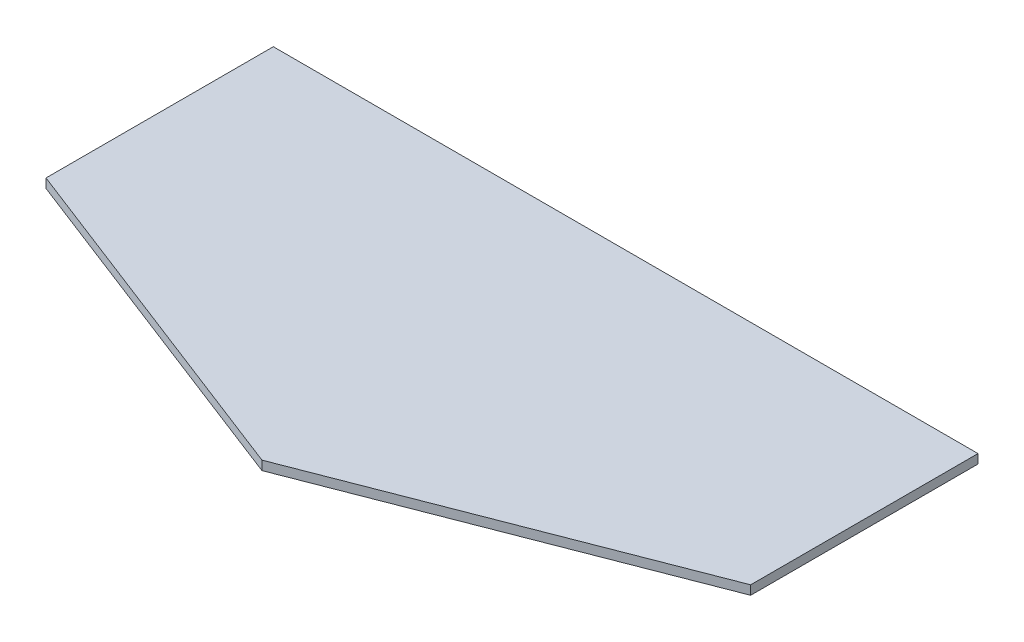
ISO-10303-21;
HEADER;
FILE_DESCRIPTION(('STEP AP214'),'2;1');
FILE_NAME('part.step','',(''),(''),'','','');
FILE_SCHEMA(('AUTOMOTIVE_DESIGN { 1 0 10303 214 1 1 1 1 }'));
ENDSEC;
DATA;
#1=APPLICATION_CONTEXT('core data for automotive mechanical design processes');
#2=APPLICATION_PROTOCOL_DEFINITION('international standard','automotive_design',2000,#1);
#3=PRODUCT_CONTEXT('',#1,'mechanical');
#4=PRODUCT('Part','Part','',(#3));
#5=PRODUCT_RELATED_PRODUCT_CATEGORY('part','',(#4));
#6=PRODUCT_DEFINITION_FORMATION('','',#4);
#7=PRODUCT_DEFINITION_CONTEXT('part definition',#1,'design');
#8=PRODUCT_DEFINITION('design','',#6,#7);
#9=PRODUCT_DEFINITION_SHAPE('','',#8);
#10=(LENGTH_UNIT() NAMED_UNIT(*) SI_UNIT(.MILLI.,.METRE.));
#11=(NAMED_UNIT(*) PLANE_ANGLE_UNIT() SI_UNIT($,.RADIAN.));
#12=(NAMED_UNIT(*) SI_UNIT($,.STERADIAN.) SOLID_ANGLE_UNIT());
#13=UNCERTAINTY_MEASURE_WITH_UNIT(LENGTH_MEASURE(1.E-05),#10,'distance_accuracy_value','');
#14=(GEOMETRIC_REPRESENTATION_CONTEXT(3) GLOBAL_UNCERTAINTY_ASSIGNED_CONTEXT((#13)) GLOBAL_UNIT_ASSIGNED_CONTEXT((#10,
#11,#12)) REPRESENTATION_CONTEXT('',''));
#15=CARTESIAN_POINT('',(0.,0.,0.));
#16=DIRECTION('',(0.,0.,1.));
#17=DIRECTION('',(1.,0.,0.));
#18=AXIS2_PLACEMENT_3D('',#15,#16,#17);
#19=CARTESIAN_POINT('',(114.531674208145,3.,128.742081447964));
#20=DIRECTION('',(-0.360994102557712,0.,-0.93256809827409));
#21=DIRECTION('',(-0.93256809827409,0.,0.360994102557712));
#22=AXIS2_PLACEMENT_3D('',#19,#20,#21);
#23=PLANE('',#22);
#24=DIRECTION('',(0.93256809827409,0.,-0.360994102557712));
#25=VECTOR('',#24,1.);
#26=CARTESIAN_POINT('',(114.531674208145,1.,128.742081447964));
#27=LINE('',#26,#25);
#28=CARTESIAN_POINT('',(155.,1.,113.076923076923));
#29=VERTEX_POINT('',#28);
#30=CARTESIAN_POINT('',(232.5,1.,83.0769230769231));
#31=VERTEX_POINT('',#30);
#32=EDGE_CURVE('E109',#29,#31,#27,.T.);
#33=ORIENTED_EDGE('',*,*,#32,.T.);
#34=DIRECTION('',(0.,-1.,0.));
#35=VECTOR('',#34,1.);
#36=CARTESIAN_POINT('',(232.5,3.,83.0769230769231));
#37=LINE('',#36,#35);
#38=CARTESIAN_POINT('',(232.5,3.,83.0769230769231));
#39=VERTEX_POINT('',#38);
#40=EDGE_CURVE('E11',#39,#31,#37,.T.);
#41=ORIENTED_EDGE('',*,*,#40,.F.);
#42=DIRECTION('',(0.93256809827409,0.,-0.360994102557712));
#43=VECTOR('',#42,1.);
#44=CARTESIAN_POINT('',(114.531674208145,3.,128.742081447964));
#45=LINE('',#44,#43);
#46=CARTESIAN_POINT('',(155.,3.,113.076923076923));
#47=VERTEX_POINT('',#46);
#48=EDGE_CURVE('E80',#47,#39,#45,.T.);
#49=ORIENTED_EDGE('',*,*,#48,.F.);
#50=DIRECTION('',(0.,-1.,0.));
#51=VECTOR('',#50,1.);
#52=CARTESIAN_POINT('',(155.,3.,113.076923076923));
#53=LINE('',#52,#51);
#54=EDGE_CURVE('E108',#47,#29,#53,.T.);
#55=ORIENTED_EDGE('',*,*,#54,.T.);
#56=EDGE_LOOP('',(#33,#41,#49,#55));
#57=FACE_BOUND('',#56,.T.);
#58=ADVANCED_FACE('F34',(#57),#23,.F.);
#59=CARTESIAN_POINT('',(232.5,3.,33.0769230769231));
#60=DIRECTION('',(1.,0.,0.));
#61=DIRECTION('',(0.,0.,-1.));
#62=AXIS2_PLACEMENT_3D('',#59,#60,#61);
#63=PLANE('',#62);
#64=DIRECTION('',(0.,0.,1.));
#65=VECTOR('',#64,1.);
#66=CARTESIAN_POINT('',(232.5,1.,33.0769230769231));
#67=LINE('',#66,#65);
#68=CARTESIAN_POINT('',(232.5,1.,33.0769230769231));
#69=VERTEX_POINT('',#68);
#70=EDGE_CURVE('E112',#69,#31,#67,.T.);
#71=ORIENTED_EDGE('',*,*,#70,.F.);
#72=DIRECTION('',(0.,-1.,0.));
#73=VECTOR('',#72,1.);
#74=CARTESIAN_POINT('',(232.5,3.,33.0769230769231));
#75=LINE('',#74,#73);
#76=CARTESIAN_POINT('',(232.5,3.,33.0769230769231));
#77=VERTEX_POINT('',#76);
#78=EDGE_CURVE('E42',#77,#69,#75,.T.);
#79=ORIENTED_EDGE('',*,*,#78,.F.);
#80=DIRECTION('',(0.,0.,1.));
#81=VECTOR('',#80,1.);
#82=CARTESIAN_POINT('',(232.5,3.,33.0769230769231));
#83=LINE('',#82,#81);
#84=EDGE_CURVE('E102',#77,#39,#83,.T.);
#85=ORIENTED_EDGE('',*,*,#84,.T.);
#86=ORIENTED_EDGE('',*,*,#40,.T.);
#87=EDGE_LOOP('',(#71,#79,#85,#86));
#88=FACE_BOUND('',#87,.T.);
#89=ADVANCED_FACE('F121',(#88),#63,.T.);
#90=CARTESIAN_POINT('',(77.5,3.,33.0769230769231));
#91=DIRECTION('',(0.,0.,-1.));
#92=DIRECTION('',(-1.,0.,0.));
#93=AXIS2_PLACEMENT_3D('',#90,#91,#92);
#94=PLANE('',#93);
#95=DIRECTION('',(1.,0.,0.));
#96=VECTOR('',#95,1.);
#97=CARTESIAN_POINT('',(77.5,1.,33.0769230769231));
#98=LINE('',#97,#96);
#99=CARTESIAN_POINT('',(77.5,1.,33.0769230769231));
#100=VERTEX_POINT('',#99);
#101=EDGE_CURVE('E94',#100,#69,#98,.T.);
#102=ORIENTED_EDGE('',*,*,#101,.F.);
#103=DIRECTION('',(0.,-1.,0.));
#104=VECTOR('',#103,1.);
#105=CARTESIAN_POINT('',(77.5,3.,33.0769230769231));
#106=LINE('',#105,#104);
#107=CARTESIAN_POINT('',(77.5,3.,33.0769230769231));
#108=VERTEX_POINT('',#107);
#109=EDGE_CURVE('E88',#108,#100,#106,.T.);
#110=ORIENTED_EDGE('',*,*,#109,.F.);
#111=DIRECTION('',(1.,0.,0.));
#112=VECTOR('',#111,1.);
#113=CARTESIAN_POINT('',(77.5,3.,33.0769230769231));
#114=LINE('',#113,#112);
#115=EDGE_CURVE('E92',#108,#77,#114,.T.);
#116=ORIENTED_EDGE('',*,*,#115,.T.);
#117=ORIENTED_EDGE('',*,*,#78,.T.);
#118=EDGE_LOOP('',(#102,#110,#116,#117));
#119=FACE_BOUND('',#118,.T.);
#120=ADVANCED_FACE('F90',(#119),#94,.T.);
#121=CARTESIAN_POINT('',(77.5,3.,33.0769230769231));
#122=DIRECTION('',(1.,0.,0.));
#123=DIRECTION('',(0.,0.,-1.));
#124=AXIS2_PLACEMENT_3D('',#121,#122,#123);
#125=PLANE('',#124);
#126=DIRECTION('',(0.,0.,1.));
#127=VECTOR('',#126,1.);
#128=CARTESIAN_POINT('',(77.5,1.,33.0769230769231));
#129=LINE('',#128,#127);
#130=CARTESIAN_POINT('',(77.5,1.,83.0769230769231));
#131=VERTEX_POINT('',#130);
#132=EDGE_CURVE('E68',#100,#131,#129,.T.);
#133=ORIENTED_EDGE('',*,*,#132,.T.);
#134=DIRECTION('',(0.,-1.,0.));
#135=VECTOR('',#134,1.);
#136=CARTESIAN_POINT('',(77.5,3.,83.0769230769231));
#137=LINE('',#136,#135);
#138=CARTESIAN_POINT('',(77.5,3.,83.0769230769231));
#139=VERTEX_POINT('',#138);
#140=EDGE_CURVE('E95',#139,#131,#137,.T.);
#141=ORIENTED_EDGE('',*,*,#140,.F.);
#142=DIRECTION('',(0.,0.,1.));
#143=VECTOR('',#142,1.);
#144=CARTESIAN_POINT('',(77.5,3.,33.0769230769231));
#145=LINE('',#144,#143);
#146=EDGE_CURVE('E97',#108,#139,#145,.T.);
#147=ORIENTED_EDGE('',*,*,#146,.F.);
#148=ORIENTED_EDGE('',*,*,#109,.T.);
#149=EDGE_LOOP('',(#133,#141,#147,#148));
#150=FACE_BOUND('',#149,.T.);
#151=ADVANCED_FACE('F98',(#150),#125,.F.);
#152=CARTESIAN_POINT('',(60.6674208144796,3.,76.5610859728507));
#153=DIRECTION('',(0.360994102557712,0.,-0.93256809827409));
#154=DIRECTION('',(-0.93256809827409,0.,-0.360994102557712));
#155=AXIS2_PLACEMENT_3D('',#152,#153,#154);
#156=PLANE('',#155);
#157=DIRECTION('',(0.93256809827409,0.,0.360994102557712));
#158=VECTOR('',#157,1.);
#159=CARTESIAN_POINT('',(60.6674208144796,1.,76.5610859728507));
#160=LINE('',#159,#158);
#161=EDGE_CURVE('E74',#131,#29,#160,.T.);
#162=ORIENTED_EDGE('',*,*,#161,.T.);
#163=ORIENTED_EDGE('',*,*,#54,.F.);
#164=DIRECTION('',(0.93256809827409,0.,0.360994102557712));
#165=VECTOR('',#164,1.);
#166=CARTESIAN_POINT('',(60.6674208144796,3.,76.5610859728507));
#167=LINE('',#166,#165);
#168=EDGE_CURVE('E50',#139,#47,#167,.T.);
#169=ORIENTED_EDGE('',*,*,#168,.F.);
#170=ORIENTED_EDGE('',*,*,#140,.T.);
#171=EDGE_LOOP('',(#162,#163,#169,#170));
#172=FACE_BOUND('',#171,.T.);
#173=ADVANCED_FACE('F126',(#172),#156,.F.);
#174=CARTESIAN_POINT('',(77.5,3.,33.0769230769231));
#175=DIRECTION('',(0.,1.,0.));
#176=DIRECTION('',(0.,0.,1.));
#177=AXIS2_PLACEMENT_3D('',#174,#175,#176);
#178=PLANE('',#177);
#179=ORIENTED_EDGE('',*,*,#48,.T.);
#180=ORIENTED_EDGE('',*,*,#84,.F.);
#181=ORIENTED_EDGE('',*,*,#115,.F.);
#182=ORIENTED_EDGE('',*,*,#146,.T.);
#183=ORIENTED_EDGE('',*,*,#168,.T.);
#184=EDGE_LOOP('',(#179,#180,#181,#182,#183));
#185=FACE_BOUND('',#184,.T.);
#186=ADVANCED_FACE('F100',(#185),#178,.T.);
#187=CARTESIAN_POINT('',(77.5,1.,33.0769230769231));
#188=DIRECTION('',(0.,1.,0.));
#189=DIRECTION('',(0.,0.,1.));
#190=AXIS2_PLACEMENT_3D('',#187,#188,#189);
#191=PLANE('',#190);
#192=ORIENTED_EDGE('',*,*,#32,.F.);
#193=ORIENTED_EDGE('',*,*,#161,.F.);
#194=ORIENTED_EDGE('',*,*,#132,.F.);
#195=ORIENTED_EDGE('',*,*,#101,.T.);
#196=ORIENTED_EDGE('',*,*,#70,.T.);
#197=EDGE_LOOP('',(#192,#193,#194,#195,#196));
#198=FACE_BOUND('',#197,.T.);
#199=ADVANCED_FACE('F124',(#198),#191,.F.);
#200=CLOSED_SHELL('',(#58,#89,#120,#151,#173,#186,#199));
#201=MANIFOLD_SOLID_BREP('B2',#200);
#202=ADVANCED_BREP_SHAPE_REPRESENTATION('',(#18,#201),#14);
#203=SHAPE_DEFINITION_REPRESENTATION(#9,#202);
ENDSEC;
END-ISO-10303-21;
